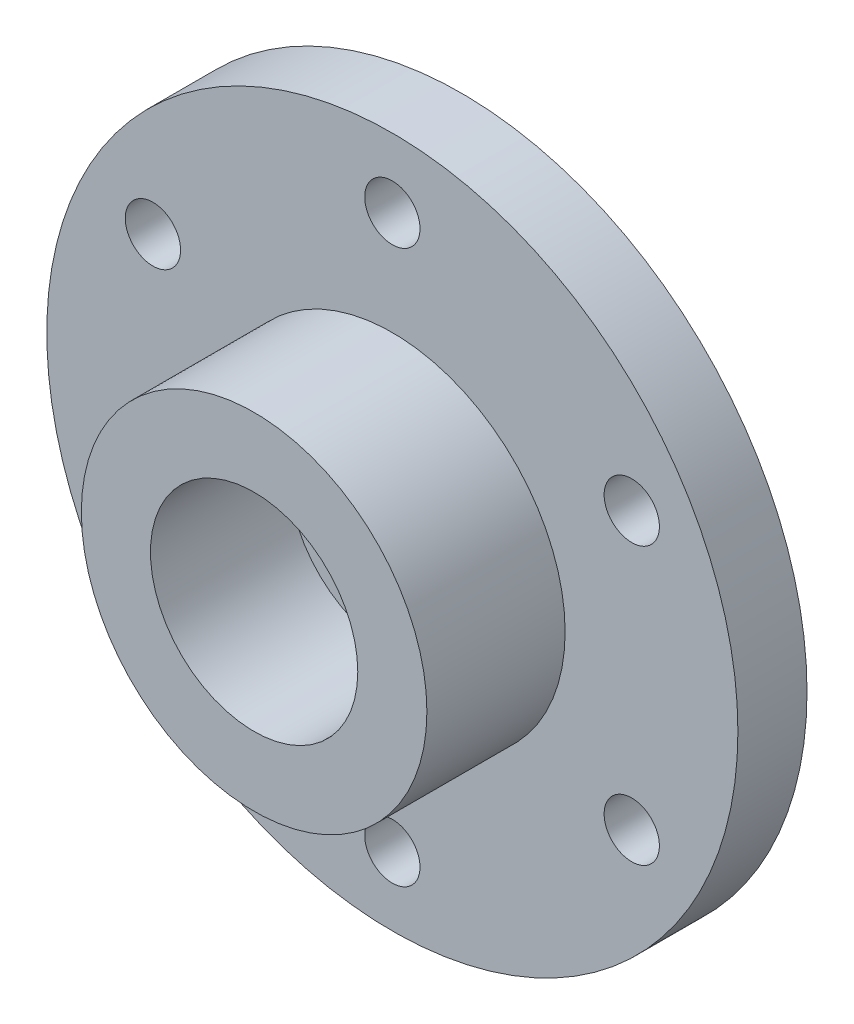
ISO-10303-21;
HEADER;
FILE_DESCRIPTION(('STEP AP214'),'2;1');
FILE_NAME('part.step','',(''),(''),'','','');
FILE_SCHEMA(('AUTOMOTIVE_DESIGN { 1 0 10303 214 1 1 1 1 }'));
ENDSEC;
DATA;
#1=APPLICATION_CONTEXT('core data for automotive mechanical design processes');
#2=APPLICATION_PROTOCOL_DEFINITION('international standard','automotive_design',2000,#1);
#3=PRODUCT_CONTEXT('',#1,'mechanical');
#4=PRODUCT('Part','Part','',(#3));
#5=PRODUCT_RELATED_PRODUCT_CATEGORY('part','',(#4));
#6=PRODUCT_DEFINITION_FORMATION('','',#4);
#7=PRODUCT_DEFINITION_CONTEXT('part definition',#1,'design');
#8=PRODUCT_DEFINITION('design','',#6,#7);
#9=PRODUCT_DEFINITION_SHAPE('','',#8);
#10=(LENGTH_UNIT() NAMED_UNIT(*) SI_UNIT(.MILLI.,.METRE.));
#11=(NAMED_UNIT(*) PLANE_ANGLE_UNIT() SI_UNIT($,.RADIAN.));
#12=(NAMED_UNIT(*) SI_UNIT($,.STERADIAN.) SOLID_ANGLE_UNIT());
#13=UNCERTAINTY_MEASURE_WITH_UNIT(LENGTH_MEASURE(1.E-05),#10,'distance_accuracy_value','');
#14=(GEOMETRIC_REPRESENTATION_CONTEXT(3) GLOBAL_UNCERTAINTY_ASSIGNED_CONTEXT((#13)) GLOBAL_UNIT_ASSIGNED_CONTEXT((#10,
#11,#12)) REPRESENTATION_CONTEXT('',''));
#15=CARTESIAN_POINT('',(0.,0.,0.));
#16=DIRECTION('',(0.,0.,1.));
#17=DIRECTION('',(1.,0.,0.));
#18=AXIS2_PLACEMENT_3D('',#15,#16,#17);
#19=CARTESIAN_POINT('',(0.,0.,5.));
#20=DIRECTION('',(0.,0.,1.));
#21=DIRECTION('',(1.,0.,0.));
#22=AXIS2_PLACEMENT_3D('',#19,#20,#21);
#23=PLANE('',#22);
#24=CARTESIAN_POINT('',(0.,0.,5.));
#25=DIRECTION('',(0.,0.,1.));
#26=DIRECTION('',(1.,0.,0.));
#27=AXIS2_PLACEMENT_3D('',#24,#25,#26);
#28=CIRCLE('',#27,12.5);
#29=CARTESIAN_POINT('',(12.5,0.,5.));
#30=VERTEX_POINT('',#29);
#31=EDGE_CURVE('E106',#30,#30,#28,.T.);
#32=ORIENTED_EDGE('',*,*,#31,.F.);
#33=EDGE_LOOP('',(#32));
#34=FACE_BOUND('',#33,.T.);
#35=CARTESIAN_POINT('',(-17.3205080756871,-10.000000000001,5.));
#36=DIRECTION('',(0.,0.,1.));
#37=DIRECTION('',(1.,0.,0.));
#38=AXIS2_PLACEMENT_3D('',#35,#36,#37);
#39=CIRCLE('',#38,2.00000000000209);
#40=CARTESIAN_POINT('',(-15.320508075685,-10.000000000001,5.));
#41=VERTEX_POINT('',#40);
#42=EDGE_CURVE('E86',#41,#41,#39,.T.);
#43=ORIENTED_EDGE('',*,*,#42,.F.);
#44=EDGE_LOOP('',(#43));
#45=FACE_BOUND('',#44,.T.);
#46=CARTESIAN_POINT('',(17.3205080756905,-9.99999999999902,5.));
#47=DIRECTION('',(0.,0.,1.));
#48=DIRECTION('',(1.,0.,0.));
#49=AXIS2_PLACEMENT_3D('',#46,#47,#48);
#50=CIRCLE('',#49,2.00000000000143);
#51=CARTESIAN_POINT('',(19.3205080756919,-9.99999999999902,5.));
#52=VERTEX_POINT('',#51);
#53=EDGE_CURVE('E70',#52,#52,#50,.T.);
#54=ORIENTED_EDGE('',*,*,#53,.F.);
#55=EDGE_LOOP('',(#54));
#56=FACE_BOUND('',#55,.T.);
#57=CARTESIAN_POINT('',(0.,20.,5.));
#58=DIRECTION('',(0.,0.,1.));
#59=DIRECTION('',(1.,0.,0.));
#60=AXIS2_PLACEMENT_3D('',#57,#58,#59);
#61=CIRCLE('',#60,2.);
#62=CARTESIAN_POINT('',(2.,20.,5.));
#63=VERTEX_POINT('',#62);
#64=EDGE_CURVE('E56',#63,#63,#61,.T.);
#65=ORIENTED_EDGE('',*,*,#64,.F.);
#66=EDGE_LOOP('',(#65));
#67=FACE_BOUND('',#66,.T.);
#68=CARTESIAN_POINT('',(0.,0.,5.));
#69=DIRECTION('',(0.,0.,1.));
#70=DIRECTION('',(1.,0.,0.));
#71=AXIS2_PLACEMENT_3D('',#68,#69,#70);
#72=CIRCLE('',#71,25.);
#73=CARTESIAN_POINT('',(25.,0.,5.));
#74=VERTEX_POINT('',#73);
#75=EDGE_CURVE('E45',#74,#74,#72,.T.);
#76=ORIENTED_EDGE('',*,*,#75,.T.);
#77=EDGE_LOOP('',(#76));
#78=FACE_BOUND('',#77,.T.);
#79=CARTESIAN_POINT('',(17.3205080756893,10.000000000001,5.));
#80=DIRECTION('',(0.,0.,1.));
#81=DIRECTION('',(1.,0.,0.));
#82=AXIS2_PLACEMENT_3D('',#79,#80,#81);
#83=CIRCLE('',#82,2.00000000000031);
#84=CARTESIAN_POINT('',(19.3205080756896,10.000000000001,5.));
#85=VERTEX_POINT('',#84);
#86=EDGE_CURVE('E62',#85,#85,#83,.T.);
#87=ORIENTED_EDGE('',*,*,#86,.F.);
#88=EDGE_LOOP('',(#87));
#89=FACE_BOUND('',#88,.T.);
#90=CARTESIAN_POINT('',(2.26638887363744E-12,-20.,5.));
#91=DIRECTION('',(0.,0.,1.));
#92=DIRECTION('',(1.,0.,0.));
#93=AXIS2_PLACEMENT_3D('',#90,#91,#92);
#94=CIRCLE('',#93,2.0000000000023);
#95=CARTESIAN_POINT('',(2.00000000000457,-20.,5.));
#96=VERTEX_POINT('',#95);
#97=EDGE_CURVE('E78',#96,#96,#94,.T.);
#98=ORIENTED_EDGE('',*,*,#97,.F.);
#99=EDGE_LOOP('',(#98));
#100=FACE_BOUND('',#99,.T.);
#101=CARTESIAN_POINT('',(-17.3205080756882,9.99999999999901,5.));
#102=DIRECTION('',(0.,0.,1.));
#103=DIRECTION('',(1.,0.,0.));
#104=AXIS2_PLACEMENT_3D('',#101,#102,#103);
#105=CIRCLE('',#104,2.00000000000107);
#106=CARTESIAN_POINT('',(-15.3205080756871,9.99999999999901,5.));
#107=VERTEX_POINT('',#106);
#108=EDGE_CURVE('E94',#107,#107,#105,.T.);
#109=ORIENTED_EDGE('',*,*,#108,.F.);
#110=EDGE_LOOP('',(#109));
#111=FACE_BOUND('',#110,.T.);
#112=ADVANCED_FACE('F37',(#34,#45,#56,#67,#78,#89,#100,#111),#23,.T.);
#113=CARTESIAN_POINT('',(0.,0.,0.));
#114=DIRECTION('',(0.,0.,1.));
#115=DIRECTION('',(1.,0.,0.));
#116=AXIS2_PLACEMENT_3D('',#113,#114,#115);
#117=PLANE('',#116);
#118=CARTESIAN_POINT('',(0.,0.,0.));
#119=DIRECTION('',(0.,0.,1.));
#120=DIRECTION('',(1.,0.,0.));
#121=AXIS2_PLACEMENT_3D('',#118,#119,#120);
#122=CIRCLE('',#121,25.);
#123=CARTESIAN_POINT('',(25.,0.,0.));
#124=VERTEX_POINT('',#123);
#125=EDGE_CURVE('E50',#124,#124,#122,.T.);
#126=ORIENTED_EDGE('',*,*,#125,.F.);
#127=EDGE_LOOP('',(#126));
#128=FACE_BOUND('',#127,.T.);
#129=CARTESIAN_POINT('',(0.,20.,0.));
#130=DIRECTION('',(0.,0.,1.));
#131=DIRECTION('',(1.,0.,0.));
#132=AXIS2_PLACEMENT_3D('',#129,#130,#131);
#133=CIRCLE('',#132,2.);
#134=CARTESIAN_POINT('',(2.,20.,0.));
#135=VERTEX_POINT('',#134);
#136=EDGE_CURVE('E58',#135,#135,#133,.T.);
#137=ORIENTED_EDGE('',*,*,#136,.T.);
#138=EDGE_LOOP('',(#137));
#139=FACE_BOUND('',#138,.T.);
#140=CARTESIAN_POINT('',(17.3205080756893,10.000000000001,0.));
#141=DIRECTION('',(0.,0.,1.));
#142=DIRECTION('',(1.,0.,0.));
#143=AXIS2_PLACEMENT_3D('',#140,#141,#142);
#144=CIRCLE('',#143,2.00000000000031);
#145=CARTESIAN_POINT('',(19.3205080756896,10.000000000001,0.));
#146=VERTEX_POINT('',#145);
#147=EDGE_CURVE('E66',#146,#146,#144,.T.);
#148=ORIENTED_EDGE('',*,*,#147,.T.);
#149=EDGE_LOOP('',(#148));
#150=FACE_BOUND('',#149,.T.);
#151=CARTESIAN_POINT('',(17.3205080756905,-9.99999999999902,0.));
#152=DIRECTION('',(0.,0.,1.));
#153=DIRECTION('',(1.,0.,0.));
#154=AXIS2_PLACEMENT_3D('',#151,#152,#153);
#155=CIRCLE('',#154,2.00000000000143);
#156=CARTESIAN_POINT('',(19.3205080756919,-9.99999999999902,0.));
#157=VERTEX_POINT('',#156);
#158=EDGE_CURVE('E74',#157,#157,#155,.T.);
#159=ORIENTED_EDGE('',*,*,#158,.T.);
#160=EDGE_LOOP('',(#159));
#161=FACE_BOUND('',#160,.T.);
#162=CARTESIAN_POINT('',(2.26638887363744E-12,-20.,0.));
#163=DIRECTION('',(0.,0.,1.));
#164=DIRECTION('',(1.,0.,0.));
#165=AXIS2_PLACEMENT_3D('',#162,#163,#164);
#166=CIRCLE('',#165,2.0000000000023);
#167=CARTESIAN_POINT('',(2.00000000000457,-20.,0.));
#168=VERTEX_POINT('',#167);
#169=EDGE_CURVE('E82',#168,#168,#166,.T.);
#170=ORIENTED_EDGE('',*,*,#169,.T.);
#171=EDGE_LOOP('',(#170));
#172=FACE_BOUND('',#171,.T.);
#173=CARTESIAN_POINT('',(-17.3205080756871,-10.000000000001,0.));
#174=DIRECTION('',(0.,0.,1.));
#175=DIRECTION('',(1.,0.,0.));
#176=AXIS2_PLACEMENT_3D('',#173,#174,#175);
#177=CIRCLE('',#176,2.00000000000209);
#178=CARTESIAN_POINT('',(-15.320508075685,-10.000000000001,0.));
#179=VERTEX_POINT('',#178);
#180=EDGE_CURVE('E90',#179,#179,#177,.T.);
#181=ORIENTED_EDGE('',*,*,#180,.T.);
#182=EDGE_LOOP('',(#181));
#183=FACE_BOUND('',#182,.T.);
#184=CARTESIAN_POINT('',(-17.3205080756882,9.99999999999901,0.));
#185=DIRECTION('',(0.,0.,1.));
#186=DIRECTION('',(1.,0.,0.));
#187=AXIS2_PLACEMENT_3D('',#184,#185,#186);
#188=CIRCLE('',#187,2.00000000000107);
#189=CARTESIAN_POINT('',(-15.3205080756871,9.99999999999901,0.));
#190=VERTEX_POINT('',#189);
#191=EDGE_CURVE('E98',#190,#190,#188,.T.);
#192=ORIENTED_EDGE('',*,*,#191,.T.);
#193=EDGE_LOOP('',(#192));
#194=FACE_BOUND('',#193,.T.);
#195=ADVANCED_FACE('F137',(#128,#139,#150,#161,#172,#183,#194),#117,.F.);
#196=CARTESIAN_POINT('',(0.,0.,5.));
#197=DIRECTION('',(0.,0.,-1.));
#198=DIRECTION('',(-1.,0.,0.));
#199=AXIS2_PLACEMENT_3D('',#196,#197,#198);
#200=CYLINDRICAL_SURFACE('',#199,25.);
#201=ORIENTED_EDGE('',*,*,#75,.F.);
#202=EDGE_LOOP('',(#201));
#203=FACE_BOUND('',#202,.T.);
#204=ORIENTED_EDGE('',*,*,#125,.T.);
#205=EDGE_LOOP('',(#204));
#206=FACE_BOUND('',#205,.T.);
#207=ADVANCED_FACE('F39',(#203,#206),#200,.T.);
#208=CARTESIAN_POINT('',(0.,20.,5.));
#209=DIRECTION('',(0.,0.,-1.));
#210=DIRECTION('',(-1.,0.,0.));
#211=AXIS2_PLACEMENT_3D('',#208,#209,#210);
#212=CYLINDRICAL_SURFACE('',#211,2.);
#213=ORIENTED_EDGE('',*,*,#64,.T.);
#214=EDGE_LOOP('',(#213));
#215=FACE_BOUND('',#214,.T.);
#216=ORIENTED_EDGE('',*,*,#136,.F.);
#217=EDGE_LOOP('',(#216));
#218=FACE_BOUND('',#217,.T.);
#219=ADVANCED_FACE('F214',(#215,#218),#212,.F.);
#220=CARTESIAN_POINT('',(17.3205080756893,10.000000000001,5.));
#221=DIRECTION('',(0.,0.,-1.));
#222=DIRECTION('',(-1.,0.,0.));
#223=AXIS2_PLACEMENT_3D('',#220,#221,#222);
#224=CYLINDRICAL_SURFACE('',#223,2.00000000000031);
#225=ORIENTED_EDGE('',*,*,#86,.T.);
#226=EDGE_LOOP('',(#225));
#227=FACE_BOUND('',#226,.T.);
#228=ORIENTED_EDGE('',*,*,#147,.F.);
#229=EDGE_LOOP('',(#228));
#230=FACE_BOUND('',#229,.T.);
#231=ADVANCED_FACE('F204',(#227,#230),#224,.F.);
#232=CARTESIAN_POINT('',(17.3205080756905,-9.99999999999902,5.));
#233=DIRECTION('',(0.,0.,-1.));
#234=DIRECTION('',(-1.,0.,0.));
#235=AXIS2_PLACEMENT_3D('',#232,#233,#234);
#236=CYLINDRICAL_SURFACE('',#235,2.00000000000143);
#237=ORIENTED_EDGE('',*,*,#53,.T.);
#238=EDGE_LOOP('',(#237));
#239=FACE_BOUND('',#238,.T.);
#240=ORIENTED_EDGE('',*,*,#158,.F.);
#241=EDGE_LOOP('',(#240));
#242=FACE_BOUND('',#241,.T.);
#243=ADVANCED_FACE('F194',(#239,#242),#236,.F.);
#244=CARTESIAN_POINT('',(2.26638887363744E-12,-20.,5.));
#245=DIRECTION('',(0.,0.,-1.));
#246=DIRECTION('',(-1.,0.,0.));
#247=AXIS2_PLACEMENT_3D('',#244,#245,#246);
#248=CYLINDRICAL_SURFACE('',#247,2.0000000000023);
#249=ORIENTED_EDGE('',*,*,#97,.T.);
#250=EDGE_LOOP('',(#249));
#251=FACE_BOUND('',#250,.T.);
#252=ORIENTED_EDGE('',*,*,#169,.F.);
#253=EDGE_LOOP('',(#252));
#254=FACE_BOUND('',#253,.T.);
#255=ADVANCED_FACE('F184',(#251,#254),#248,.F.);
#256=CARTESIAN_POINT('',(-17.3205080756871,-10.000000000001,5.));
#257=DIRECTION('',(0.,0.,-1.));
#258=DIRECTION('',(-1.,0.,0.));
#259=AXIS2_PLACEMENT_3D('',#256,#257,#258);
#260=CYLINDRICAL_SURFACE('',#259,2.00000000000209);
#261=ORIENTED_EDGE('',*,*,#42,.T.);
#262=EDGE_LOOP('',(#261));
#263=FACE_BOUND('',#262,.T.);
#264=ORIENTED_EDGE('',*,*,#180,.F.);
#265=EDGE_LOOP('',(#264));
#266=FACE_BOUND('',#265,.T.);
#267=ADVANCED_FACE('F132',(#263,#266),#260,.F.);
#268=CARTESIAN_POINT('',(-17.3205080756882,9.99999999999901,5.));
#269=DIRECTION('',(0.,0.,-1.));
#270=DIRECTION('',(-1.,0.,0.));
#271=AXIS2_PLACEMENT_3D('',#268,#269,#270);
#272=CYLINDRICAL_SURFACE('',#271,2.00000000000107);
#273=ORIENTED_EDGE('',*,*,#108,.T.);
#274=EDGE_LOOP('',(#273));
#275=FACE_BOUND('',#274,.T.);
#276=ORIENTED_EDGE('',*,*,#191,.F.);
#277=EDGE_LOOP('',(#276));
#278=FACE_BOUND('',#277,.T.);
#279=ADVANCED_FACE('F123',(#275,#278),#272,.F.);
#280=CARTESIAN_POINT('',(0.,0.,15.));
#281=DIRECTION('',(0.,0.,1.));
#282=DIRECTION('',(1.,0.,0.));
#283=AXIS2_PLACEMENT_3D('',#280,#281,#282);
#284=PLANE('',#283);
#285=CARTESIAN_POINT('',(0.,0.,15.));
#286=DIRECTION('',(0.,0.,1.));
#287=DIRECTION('',(1.,0.,0.));
#288=AXIS2_PLACEMENT_3D('',#285,#286,#287);
#289=CIRCLE('',#288,12.5);
#290=CARTESIAN_POINT('',(12.5,0.,15.));
#291=VERTEX_POINT('',#290);
#292=EDGE_CURVE('E102',#291,#291,#289,.T.);
#293=ORIENTED_EDGE('',*,*,#292,.T.);
#294=EDGE_LOOP('',(#293));
#295=FACE_BOUND('',#294,.T.);
#296=CARTESIAN_POINT('',(0.,0.,15.));
#297=DIRECTION('',(0.,0.,1.));
#298=DIRECTION('',(1.,0.,0.));
#299=AXIS2_PLACEMENT_3D('',#296,#297,#298);
#300=CIRCLE('',#299,7.5);
#301=CARTESIAN_POINT('',(7.5,0.,15.));
#302=VERTEX_POINT('',#301);
#303=EDGE_CURVE('E110',#302,#302,#300,.T.);
#304=ORIENTED_EDGE('',*,*,#303,.F.);
#305=EDGE_LOOP('',(#304));
#306=FACE_BOUND('',#305,.T.);
#307=ADVANCED_FACE('F120',(#295,#306),#284,.T.);
#308=CARTESIAN_POINT('',(0.,0.,15.));
#309=DIRECTION('',(0.,0.,-1.));
#310=DIRECTION('',(-1.,0.,0.));
#311=AXIS2_PLACEMENT_3D('',#308,#309,#310);
#312=CYLINDRICAL_SURFACE('',#311,12.5);
#313=ORIENTED_EDGE('',*,*,#292,.F.);
#314=EDGE_LOOP('',(#313));
#315=FACE_BOUND('',#314,.T.);
#316=ORIENTED_EDGE('',*,*,#31,.T.);
#317=EDGE_LOOP('',(#316));
#318=FACE_BOUND('',#317,.T.);
#319=ADVANCED_FACE('F122',(#315,#318),#312,.T.);
#320=CARTESIAN_POINT('',(0.,0.,15.));
#321=DIRECTION('',(0.,0.,-1.));
#322=DIRECTION('',(-1.,0.,0.));
#323=AXIS2_PLACEMENT_3D('',#320,#321,#322);
#324=CYLINDRICAL_SURFACE('',#323,7.5);
#325=ORIENTED_EDGE('',*,*,#303,.T.);
#326=EDGE_LOOP('',(#325));
#327=FACE_BOUND('',#326,.T.);
#328=CARTESIAN_POINT('',(0.,0.,5.));
#329=DIRECTION('',(0.,0.,1.));
#330=DIRECTION('',(1.,0.,0.));
#331=AXIS2_PLACEMENT_3D('',#328,#329,#330);
#332=CIRCLE('',#331,7.5);
#333=CARTESIAN_POINT('',(7.5,0.,5.));
#334=VERTEX_POINT('',#333);
#335=EDGE_CURVE('E10',#334,#334,#332,.F.);
#336=ORIENTED_EDGE('',*,*,#335,.T.);
#337=EDGE_LOOP('',(#336));
#338=FACE_BOUND('',#337,.T.);
#339=ADVANCED_FACE('F118',(#327,#338),#324,.F.);
#340=ORIENTED_EDGE('',*,*,#335,.F.);
#341=EDGE_LOOP('',(#340));
#342=FACE_BOUND('',#341,.T.);
#343=ADVANCED_FACE('F140',(#342),#23,.T.);
#344=CLOSED_SHELL('',(#112,#195,#207,#219,#231,#243,#255,#267,#279,#307,#319,#339,#343));
#345=MANIFOLD_SOLID_BREP('B2',#344);
#346=ADVANCED_BREP_SHAPE_REPRESENTATION('',(#18,#345),#14);
#347=SHAPE_DEFINITION_REPRESENTATION(#9,#346);
ENDSEC;
END-ISO-10303-21;
